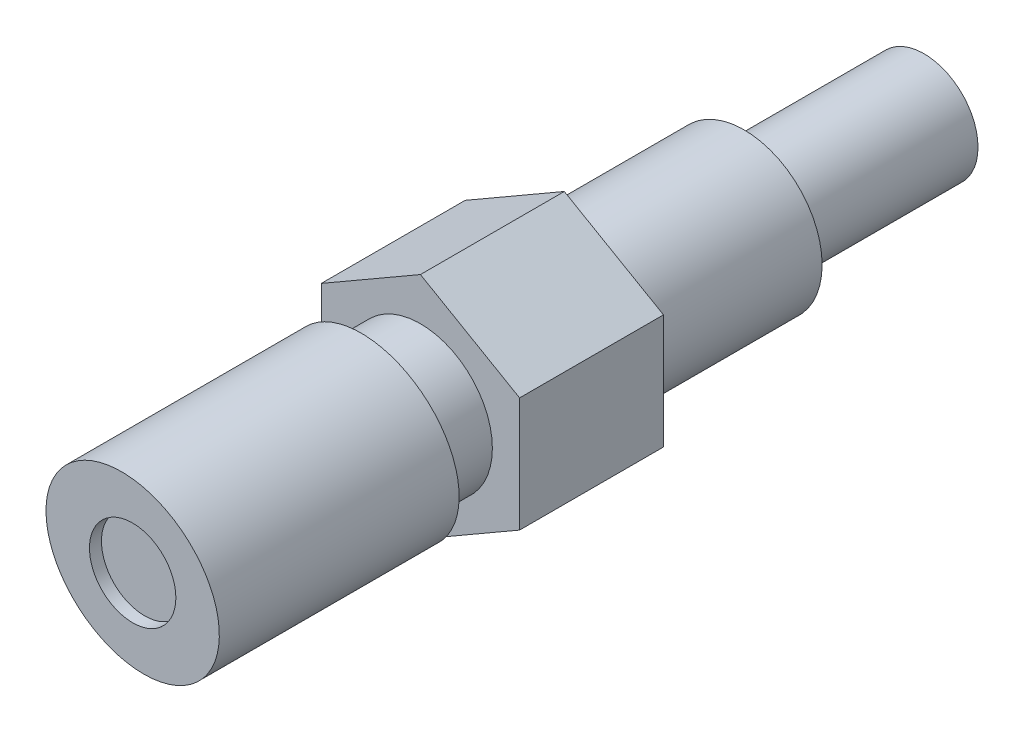
ISO-10303-21;
HEADER;
FILE_DESCRIPTION(('STEP AP214'),'2;1');
FILE_NAME('part.step','',(''),(''),'','','');
FILE_SCHEMA(('AUTOMOTIVE_DESIGN { 1 0 10303 214 1 1 1 1 }'));
ENDSEC;
DATA;
#1=APPLICATION_CONTEXT('core data for automotive mechanical design processes');
#2=APPLICATION_PROTOCOL_DEFINITION('international standard','automotive_design',2000,#1);
#3=PRODUCT_CONTEXT('',#1,'mechanical');
#4=PRODUCT('Part','Part','',(#3));
#5=PRODUCT_RELATED_PRODUCT_CATEGORY('part','',(#4));
#6=PRODUCT_DEFINITION_FORMATION('','',#4);
#7=PRODUCT_DEFINITION_CONTEXT('part definition',#1,'design');
#8=PRODUCT_DEFINITION('design','',#6,#7);
#9=PRODUCT_DEFINITION_SHAPE('','',#8);
#10=(LENGTH_UNIT() NAMED_UNIT(*) SI_UNIT(.MILLI.,.METRE.));
#11=(NAMED_UNIT(*) PLANE_ANGLE_UNIT() SI_UNIT($,.RADIAN.));
#12=(NAMED_UNIT(*) SI_UNIT($,.STERADIAN.) SOLID_ANGLE_UNIT());
#13=UNCERTAINTY_MEASURE_WITH_UNIT(LENGTH_MEASURE(1.E-05),#10,'distance_accuracy_value','');
#14=(GEOMETRIC_REPRESENTATION_CONTEXT(3) GLOBAL_UNCERTAINTY_ASSIGNED_CONTEXT((#13)) GLOBAL_UNIT_ASSIGNED_CONTEXT((#10,
#11,#12)) REPRESENTATION_CONTEXT('',''));
#15=CARTESIAN_POINT('',(0.,0.,0.));
#16=DIRECTION('',(0.,0.,1.));
#17=DIRECTION('',(1.,0.,0.));
#18=AXIS2_PLACEMENT_3D('',#15,#16,#17);
#19=CARTESIAN_POINT('',(0.,0.,15.));
#20=DIRECTION('',(0.,0.,-1.));
#21=DIRECTION('',(-1.,0.,0.));
#22=AXIS2_PLACEMENT_3D('',#19,#20,#21);
#23=CYLINDRICAL_SURFACE('',#22,4.5);
#24=CARTESIAN_POINT('',(0.,0.,15.));
#25=DIRECTION('',(0.,0.,1.));
#26=DIRECTION('',(1.,0.,0.));
#27=AXIS2_PLACEMENT_3D('',#24,#25,#26);
#28=CIRCLE('',#27,4.5);
#29=CARTESIAN_POINT('',(4.5,0.,15.));
#30=VERTEX_POINT('',#29);
#31=EDGE_CURVE('E11',#30,#30,#28,.T.);
#32=ORIENTED_EDGE('',*,*,#31,.F.);
#33=EDGE_LOOP('',(#32));
#34=FACE_BOUND('',#33,.T.);
#35=CARTESIAN_POINT('',(0.,0.,0.));
#36=DIRECTION('',(0.,0.,1.));
#37=DIRECTION('',(1.,0.,0.));
#38=AXIS2_PLACEMENT_3D('',#35,#36,#37);
#39=CIRCLE('',#38,4.5);
#40=CARTESIAN_POINT('',(4.5,0.,0.));
#41=VERTEX_POINT('',#40);
#42=EDGE_CURVE('E35',#41,#41,#39,.T.);
#43=ORIENTED_EDGE('',*,*,#42,.T.);
#44=EDGE_LOOP('',(#43));
#45=FACE_BOUND('',#44,.T.);
#46=ADVANCED_FACE('F32',(#34,#45),#23,.T.);
#47=CARTESIAN_POINT('',(0.,0.,0.));
#48=DIRECTION('',(0.,0.,1.));
#49=DIRECTION('',(1.,0.,0.));
#50=AXIS2_PLACEMENT_3D('',#47,#48,#49);
#51=PLANE('',#50);
#52=ORIENTED_EDGE('',*,*,#42,.F.);
#53=EDGE_LOOP('',(#52));
#54=FACE_BOUND('',#53,.T.);
#55=ADVANCED_FACE('F158',(#54),#51,.F.);
#56=CARTESIAN_POINT('',(0.,0.,30.));
#57=DIRECTION('',(0.,0.,-1.));
#58=DIRECTION('',(-1.,0.,0.));
#59=AXIS2_PLACEMENT_3D('',#56,#57,#58);
#60=CYLINDRICAL_SURFACE('',#59,6.5);
#61=CARTESIAN_POINT('',(0.,0.,30.));
#62=DIRECTION('',(0.,0.,1.));
#63=DIRECTION('',(1.,0.,0.));
#64=AXIS2_PLACEMENT_3D('',#61,#62,#63);
#65=CIRCLE('',#64,6.5);
#66=CARTESIAN_POINT('',(6.5,0.,30.));
#67=VERTEX_POINT('',#66);
#68=EDGE_CURVE('E138',#67,#67,#65,.T.);
#69=ORIENTED_EDGE('',*,*,#68,.F.);
#70=EDGE_LOOP('',(#69));
#71=FACE_BOUND('',#70,.T.);
#72=CARTESIAN_POINT('',(0.,0.,15.));
#73=DIRECTION('',(0.,0.,1.));
#74=DIRECTION('',(1.,0.,0.));
#75=AXIS2_PLACEMENT_3D('',#72,#73,#74);
#76=CIRCLE('',#75,6.5);
#77=CARTESIAN_POINT('',(6.5,0.,15.));
#78=VERTEX_POINT('',#77);
#79=EDGE_CURVE('E137',#78,#78,#76,.T.);
#80=ORIENTED_EDGE('',*,*,#79,.T.);
#81=EDGE_LOOP('',(#80));
#82=FACE_BOUND('',#81,.T.);
#83=ADVANCED_FACE('F144',(#71,#82),#60,.T.);
#84=CARTESIAN_POINT('',(0.,0.,15.));
#85=DIRECTION('',(0.,0.,1.));
#86=DIRECTION('',(1.,0.,0.));
#87=AXIS2_PLACEMENT_3D('',#84,#85,#86);
#88=PLANE('',#87);
#89=ORIENTED_EDGE('',*,*,#31,.T.);
#90=EDGE_LOOP('',(#89));
#91=FACE_BOUND('',#90,.T.);
#92=ORIENTED_EDGE('',*,*,#79,.F.);
#93=EDGE_LOOP('',(#92));
#94=FACE_BOUND('',#93,.T.);
#95=ADVANCED_FACE('F146',(#91,#94),#88,.F.);
#96=CARTESIAN_POINT('',(-8.26942769592284,-4.77435630628533,42.));
#97=DIRECTION('',(0.499999999999995,0.866025403784442,0.));
#98=DIRECTION('',(-0.866025403784442,0.499999999999995,0.));
#99=AXIS2_PLACEMENT_3D('',#96,#97,#98);
#100=PLANE('',#99);
#101=DIRECTION('',(0.866025403784441,-0.499999999999995,0.));
#102=VECTOR('',#101,1.);
#103=CARTESIAN_POINT('',(-8.26942769592284,-4.77435630628533,30.));
#104=LINE('',#103,#102);
#105=CARTESIAN_POINT('',(-8.26942769592284,-4.77435630628533,30.));
#106=VERTEX_POINT('',#105);
#107=CARTESIAN_POINT('',(0.,-9.54871261257047,30.));
#108=VERTEX_POINT('',#107);
#109=EDGE_CURVE('E117',#106,#108,#104,.T.);
#110=ORIENTED_EDGE('',*,*,#109,.T.);
#111=DIRECTION('',(0.,0.,-1.));
#112=VECTOR('',#111,1.);
#113=CARTESIAN_POINT('',(0.,-9.54871261257047,42.));
#114=LINE('',#113,#112);
#115=CARTESIAN_POINT('',(0.,-9.54871261257047,42.));
#116=VERTEX_POINT('',#115);
#117=EDGE_CURVE('E135',#116,#108,#114,.T.);
#118=ORIENTED_EDGE('',*,*,#117,.F.);
#119=DIRECTION('',(0.866025403784441,-0.499999999999995,0.));
#120=VECTOR('',#119,1.);
#121=CARTESIAN_POINT('',(-8.26942769592284,-4.77435630628533,42.));
#122=LINE('',#121,#120);
#123=CARTESIAN_POINT('',(-8.26942769592284,-4.77435630628533,42.));
#124=VERTEX_POINT('',#123);
#125=EDGE_CURVE('E128',#124,#116,#122,.T.);
#126=ORIENTED_EDGE('',*,*,#125,.F.);
#127=DIRECTION('',(0.,0.,-1.));
#128=VECTOR('',#127,1.);
#129=CARTESIAN_POINT('',(-8.26942769592284,-4.77435630628533,42.));
#130=LINE('',#129,#128);
#131=EDGE_CURVE('E113',#124,#106,#130,.T.);
#132=ORIENTED_EDGE('',*,*,#131,.T.);
#133=EDGE_LOOP('',(#110,#118,#126,#132));
#134=FACE_BOUND('',#133,.T.);
#135=ADVANCED_FACE('F148',(#134),#100,.F.);
#136=CARTESIAN_POINT('',(0.,-9.54871261257047,42.));
#137=DIRECTION('',(-0.500000000000001,0.866025403784438,0.));
#138=DIRECTION('',(-0.866025403784438,-0.500000000000001,0.));
#139=AXIS2_PLACEMENT_3D('',#136,#137,#138);
#140=PLANE('',#139);
#141=DIRECTION('',(0.866025403784438,0.500000000000001,0.));
#142=VECTOR('',#141,1.);
#143=CARTESIAN_POINT('',(0.,-9.54871261257047,30.));
#144=LINE('',#143,#142);
#145=CARTESIAN_POINT('',(8.26942769592291,-4.77435630628521,30.));
#146=VERTEX_POINT('',#145);
#147=EDGE_CURVE('E120',#108,#146,#144,.T.);
#148=ORIENTED_EDGE('',*,*,#147,.T.);
#149=DIRECTION('',(0.,0.,-1.));
#150=VECTOR('',#149,1.);
#151=CARTESIAN_POINT('',(8.26942769592291,-4.77435630628521,42.));
#152=LINE('',#151,#150);
#153=CARTESIAN_POINT('',(8.26942769592291,-4.77435630628521,42.));
#154=VERTEX_POINT('',#153);
#155=EDGE_CURVE('E132',#154,#146,#152,.T.);
#156=ORIENTED_EDGE('',*,*,#155,.F.);
#157=DIRECTION('',(0.866025403784438,0.500000000000001,0.));
#158=VECTOR('',#157,1.);
#159=CARTESIAN_POINT('',(0.,-9.54871261257047,42.));
#160=LINE('',#159,#158);
#161=EDGE_CURVE('E86',#116,#154,#160,.T.);
#162=ORIENTED_EDGE('',*,*,#161,.F.);
#163=ORIENTED_EDGE('',*,*,#117,.T.);
#164=EDGE_LOOP('',(#148,#156,#162,#163));
#165=FACE_BOUND('',#164,.T.);
#166=ADVANCED_FACE('F155',(#165),#140,.F.);
#167=CARTESIAN_POINT('',(8.26942769592291,-4.77435630628521,42.));
#168=DIRECTION('',(-1.,0.,0.));
#169=DIRECTION('',(0.,-1.,0.));
#170=AXIS2_PLACEMENT_3D('',#167,#168,#169);
#171=PLANE('',#170);
#172=DIRECTION('',(0.,1.,0.));
#173=VECTOR('',#172,1.);
#174=CARTESIAN_POINT('',(8.26942769592291,-4.77435630628521,30.));
#175=LINE('',#174,#173);
#176=CARTESIAN_POINT('',(8.26942769592288,4.77435630628527,30.));
#177=VERTEX_POINT('',#176);
#178=EDGE_CURVE('E123',#146,#177,#175,.T.);
#179=ORIENTED_EDGE('',*,*,#178,.T.);
#180=DIRECTION('',(0.,0.,-1.));
#181=VECTOR('',#180,1.);
#182=CARTESIAN_POINT('',(8.26942769592288,4.77435630628527,42.));
#183=LINE('',#182,#181);
#184=CARTESIAN_POINT('',(8.26942769592288,4.77435630628527,42.));
#185=VERTEX_POINT('',#184);
#186=EDGE_CURVE('E108',#185,#177,#183,.T.);
#187=ORIENTED_EDGE('',*,*,#186,.F.);
#188=DIRECTION('',(0.,1.,0.));
#189=VECTOR('',#188,1.);
#190=CARTESIAN_POINT('',(8.26942769592291,-4.77435630628521,42.));
#191=LINE('',#190,#189);
#192=EDGE_CURVE('E99',#154,#185,#191,.T.);
#193=ORIENTED_EDGE('',*,*,#192,.F.);
#194=ORIENTED_EDGE('',*,*,#155,.T.);
#195=EDGE_LOOP('',(#179,#187,#193,#194));
#196=FACE_BOUND('',#195,.T.);
#197=ADVANCED_FACE('F196',(#196),#171,.F.);
#198=CARTESIAN_POINT('',(8.26942769592288,4.77435630628527,42.));
#199=DIRECTION('',(-0.499999999999995,-0.866025403784441,0.));
#200=DIRECTION('',(0.866025403784442,-0.499999999999995,0.));
#201=AXIS2_PLACEMENT_3D('',#198,#199,#200);
#202=PLANE('',#201);
#203=DIRECTION('',(-0.866025403784442,0.499999999999995,0.));
#204=VECTOR('',#203,1.);
#205=CARTESIAN_POINT('',(8.26942769592288,4.77435630628527,30.));
#206=LINE('',#205,#204);
#207=CARTESIAN_POINT('',(0.,9.54871261257047,30.));
#208=VERTEX_POINT('',#207);
#209=EDGE_CURVE('E107',#177,#208,#206,.T.);
#210=ORIENTED_EDGE('',*,*,#209,.T.);
#211=DIRECTION('',(0.,0.,-1.));
#212=VECTOR('',#211,1.);
#213=CARTESIAN_POINT('',(0.,9.54871261257047,42.));
#214=LINE('',#213,#212);
#215=CARTESIAN_POINT('',(0.,9.54871261257047,42.));
#216=VERTEX_POINT('',#215);
#217=EDGE_CURVE('E104',#216,#208,#214,.T.);
#218=ORIENTED_EDGE('',*,*,#217,.F.);
#219=DIRECTION('',(-0.866025403784442,0.499999999999995,0.));
#220=VECTOR('',#219,1.);
#221=CARTESIAN_POINT('',(8.26942769592288,4.77435630628527,42.));
#222=LINE('',#221,#220);
#223=EDGE_CURVE('E93',#185,#216,#222,.T.);
#224=ORIENTED_EDGE('',*,*,#223,.F.);
#225=ORIENTED_EDGE('',*,*,#186,.T.);
#226=EDGE_LOOP('',(#210,#218,#224,#225));
#227=FACE_BOUND('',#226,.T.);
#228=ADVANCED_FACE('F105',(#227),#202,.F.);
#229=CARTESIAN_POINT('',(0.,9.54871261257047,42.));
#230=DIRECTION('',(0.500000000000007,-0.866025403784434,0.));
#231=DIRECTION('',(0.866025403784435,0.500000000000007,0.));
#232=AXIS2_PLACEMENT_3D('',#229,#230,#231);
#233=PLANE('',#232);
#234=DIRECTION('',(-0.866025403784435,-0.500000000000007,0.));
#235=VECTOR('',#234,1.);
#236=CARTESIAN_POINT('',(0.,9.54871261257047,30.));
#237=LINE('',#236,#235);
#238=CARTESIAN_POINT('',(-8.26942769592294,4.77435630628516,30.));
#239=VERTEX_POINT('',#238);
#240=EDGE_CURVE('E71',#208,#239,#237,.T.);
#241=ORIENTED_EDGE('',*,*,#240,.T.);
#242=DIRECTION('',(0.,0.,-1.));
#243=VECTOR('',#242,1.);
#244=CARTESIAN_POINT('',(-8.26942769592294,4.77435630628516,42.));
#245=LINE('',#244,#243);
#246=CARTESIAN_POINT('',(-8.26942769592294,4.77435630628516,42.));
#247=VERTEX_POINT('',#246);
#248=EDGE_CURVE('E109',#247,#239,#245,.T.);
#249=ORIENTED_EDGE('',*,*,#248,.F.);
#250=DIRECTION('',(-0.866025403784435,-0.500000000000007,0.));
#251=VECTOR('',#250,1.);
#252=CARTESIAN_POINT('',(0.,9.54871261257047,42.));
#253=LINE('',#252,#251);
#254=EDGE_CURVE('E97',#216,#247,#253,.T.);
#255=ORIENTED_EDGE('',*,*,#254,.F.);
#256=ORIENTED_EDGE('',*,*,#217,.T.);
#257=EDGE_LOOP('',(#241,#249,#255,#256));
#258=FACE_BOUND('',#257,.T.);
#259=ADVANCED_FACE('F111',(#258),#233,.F.);
#260=CARTESIAN_POINT('',(-8.26942769592294,4.77435630628516,42.));
#261=DIRECTION('',(1.,0.,0.));
#262=DIRECTION('',(0.,1.,0.));
#263=AXIS2_PLACEMENT_3D('',#260,#261,#262);
#264=PLANE('',#263);
#265=DIRECTION('',(0.,-1.,0.));
#266=VECTOR('',#265,1.);
#267=CARTESIAN_POINT('',(-8.26942769592294,4.77435630628516,30.));
#268=LINE('',#267,#266);
#269=EDGE_CURVE('E77',#239,#106,#268,.T.);
#270=ORIENTED_EDGE('',*,*,#269,.T.);
#271=ORIENTED_EDGE('',*,*,#131,.F.);
#272=DIRECTION('',(0.,-1.,0.));
#273=VECTOR('',#272,1.);
#274=CARTESIAN_POINT('',(-8.26942769592294,4.77435630628516,42.));
#275=LINE('',#274,#273);
#276=EDGE_CURVE('E48',#247,#124,#275,.T.);
#277=ORIENTED_EDGE('',*,*,#276,.F.);
#278=ORIENTED_EDGE('',*,*,#248,.T.);
#279=EDGE_LOOP('',(#270,#271,#277,#278));
#280=FACE_BOUND('',#279,.T.);
#281=ADVANCED_FACE('F222',(#280),#264,.F.);
#282=CARTESIAN_POINT('',(0.,0.,42.));
#283=DIRECTION('',(0.,0.,1.));
#284=DIRECTION('',(1.,0.,0.));
#285=AXIS2_PLACEMENT_3D('',#282,#283,#284);
#286=PLANE('',#285);
#287=CARTESIAN_POINT('',(0.,0.,42.));
#288=DIRECTION('',(0.,0.,1.));
#289=DIRECTION('',(1.,0.,0.));
#290=AXIS2_PLACEMENT_3D('',#287,#288,#289);
#291=CIRCLE('',#290,6.);
#292=CARTESIAN_POINT('',(6.,0.,42.));
#293=VERTEX_POINT('',#292);
#294=EDGE_CURVE('E320',#293,#293,#291,.T.);
#295=ORIENTED_EDGE('',*,*,#294,.F.);
#296=EDGE_LOOP('',(#295));
#297=FACE_BOUND('',#296,.T.);
#298=ORIENTED_EDGE('',*,*,#125,.T.);
#299=ORIENTED_EDGE('',*,*,#161,.T.);
#300=ORIENTED_EDGE('',*,*,#192,.T.);
#301=ORIENTED_EDGE('',*,*,#223,.T.);
#302=ORIENTED_EDGE('',*,*,#254,.T.);
#303=ORIENTED_EDGE('',*,*,#276,.T.);
#304=EDGE_LOOP('',(#298,#299,#300,#301,#302,#303));
#305=FACE_BOUND('',#304,.T.);
#306=ADVANCED_FACE('F95',(#297,#305),#286,.T.);
#307=CARTESIAN_POINT('',(0.,0.,30.));
#308=DIRECTION('',(0.,0.,1.));
#309=DIRECTION('',(1.,0.,0.));
#310=AXIS2_PLACEMENT_3D('',#307,#308,#309);
#311=PLANE('',#310);
#312=ORIENTED_EDGE('',*,*,#68,.T.);
#313=EDGE_LOOP('',(#312));
#314=FACE_BOUND('',#313,.T.);
#315=ORIENTED_EDGE('',*,*,#109,.F.);
#316=ORIENTED_EDGE('',*,*,#269,.F.);
#317=ORIENTED_EDGE('',*,*,#240,.F.);
#318=ORIENTED_EDGE('',*,*,#209,.F.);
#319=ORIENTED_EDGE('',*,*,#178,.F.);
#320=ORIENTED_EDGE('',*,*,#147,.F.);
#321=EDGE_LOOP('',(#315,#316,#317,#318,#319,#320));
#322=FACE_BOUND('',#321,.T.);
#323=ADVANCED_FACE('F237',(#314,#322),#311,.F.);
#324=CARTESIAN_POINT('',(0.,0.,46.));
#325=DIRECTION('',(0.,0.,-1.));
#326=DIRECTION('',(-1.,0.,0.));
#327=AXIS2_PLACEMENT_3D('',#324,#325,#326);
#328=CYLINDRICAL_SURFACE('',#327,6.);
#329=CARTESIAN_POINT('',(0.,0.,46.));
#330=DIRECTION('',(0.,0.,1.));
#331=DIRECTION('',(1.,0.,0.));
#332=AXIS2_PLACEMENT_3D('',#329,#330,#331);
#333=CIRCLE('',#332,6.);
#334=CARTESIAN_POINT('',(6.,0.,46.));
#335=VERTEX_POINT('',#334);
#336=EDGE_CURVE('E121',#335,#335,#333,.T.);
#337=ORIENTED_EDGE('',*,*,#336,.F.);
#338=EDGE_LOOP('',(#337));
#339=FACE_BOUND('',#338,.T.);
#340=ORIENTED_EDGE('',*,*,#294,.T.);
#341=EDGE_LOOP('',(#340));
#342=FACE_BOUND('',#341,.T.);
#343=ADVANCED_FACE('F242',(#339,#342),#328,.T.);
#344=CARTESIAN_POINT('',(0.,0.,66.));
#345=DIRECTION('',(0.,0.,1.));
#346=DIRECTION('',(0.833044377310739,-0.553206169010218,0.));
#347=AXIS2_PLACEMENT_3D('',#344,#345,#346);
#348=ELLIPSE('',#347,7.51268499768407,6.5350839600044);
#349=DIRECTION('',(0.,0.,-1.));
#350=VECTOR('',#349,1.);
#351=SURFACE_OF_LINEAR_EXTRUSION('',#348,#350);
#352=CARTESIAN_POINT('',(6.25839999582746,-4.15606368654934,66.));
#353=VERTEX_POINT('',#352);
#354=EDGE_CURVE('E315',#353,#353,#348,.T.);
#355=ORIENTED_EDGE('',*,*,#354,.F.);
#356=EDGE_LOOP('',(#355));
#357=FACE_BOUND('',#356,.T.);
#358=CARTESIAN_POINT('',(0.,0.,46.));
#359=DIRECTION('',(0.,0.,1.));
#360=DIRECTION('',(0.833044377310739,-0.553206169010218,0.));
#361=AXIS2_PLACEMENT_3D('',#358,#359,#360);
#362=ELLIPSE('',#361,7.51268499768407,6.5350839600044);
#363=CARTESIAN_POINT('',(6.25839999582746,-4.15606368654934,46.));
#364=VERTEX_POINT('',#363);
#365=EDGE_CURVE('E321',#364,#364,#362,.T.);
#366=ORIENTED_EDGE('',*,*,#365,.T.);
#367=EDGE_LOOP('',(#366));
#368=FACE_BOUND('',#367,.T.);
#369=ADVANCED_FACE('F259',(#357,#368),#351,.F.);
#370=CARTESIAN_POINT('',(0.,0.,66.));
#371=DIRECTION('',(0.,0.,1.));
#372=DIRECTION('',(1.,0.,0.));
#373=AXIS2_PLACEMENT_3D('',#370,#371,#372);
#374=PLANE('',#373);
#375=CARTESIAN_POINT('',(0.,0.,66.));
#376=DIRECTION('',(0.,0.,1.));
#377=DIRECTION('',(1.,0.,0.));
#378=AXIS2_PLACEMENT_3D('',#375,#376,#377);
#379=CIRCLE('',#378,3.6032344244822);
#380=CARTESIAN_POINT('',(3.6032344244822,0.,66.));
#381=VERTEX_POINT('',#380);
#382=EDGE_CURVE('E322',#381,#381,#379,.T.);
#383=ORIENTED_EDGE('',*,*,#382,.F.);
#384=EDGE_LOOP('',(#383));
#385=FACE_BOUND('',#384,.T.);
#386=ORIENTED_EDGE('',*,*,#354,.T.);
#387=EDGE_LOOP('',(#386));
#388=FACE_BOUND('',#387,.T.);
#389=ADVANCED_FACE('F269',(#385,#388),#374,.T.);
#390=CARTESIAN_POINT('',(0.,0.,46.));
#391=DIRECTION('',(0.,0.,1.));
#392=DIRECTION('',(1.,0.,0.));
#393=AXIS2_PLACEMENT_3D('',#390,#391,#392);
#394=PLANE('',#393);
#395=ORIENTED_EDGE('',*,*,#336,.T.);
#396=EDGE_LOOP('',(#395));
#397=FACE_BOUND('',#396,.T.);
#398=ORIENTED_EDGE('',*,*,#365,.F.);
#399=EDGE_LOOP('',(#398));
#400=FACE_BOUND('',#399,.T.);
#401=ADVANCED_FACE('F277',(#397,#400),#394,.F.);
#402=CARTESIAN_POINT('',(0.,0.,65.));
#403=DIRECTION('',(0.,0.,1.));
#404=DIRECTION('',(1.,0.,0.));
#405=AXIS2_PLACEMENT_3D('',#402,#403,#404);
#406=CYLINDRICAL_SURFACE('',#405,3.6032344244822);
#407=CARTESIAN_POINT('',(0.,0.,65.));
#408=DIRECTION('',(0.,0.,1.));
#409=DIRECTION('',(1.,0.,0.));
#410=AXIS2_PLACEMENT_3D('',#407,#408,#409);
#411=CIRCLE('',#410,3.6032344244822);
#412=CARTESIAN_POINT('',(3.6032344244822,0.,65.));
#413=VERTEX_POINT('',#412);
#414=EDGE_CURVE('E326',#413,#413,#411,.T.);
#415=ORIENTED_EDGE('',*,*,#414,.F.);
#416=EDGE_LOOP('',(#415));
#417=FACE_BOUND('',#416,.T.);
#418=ORIENTED_EDGE('',*,*,#382,.T.);
#419=EDGE_LOOP('',(#418));
#420=FACE_BOUND('',#419,.T.);
#421=ADVANCED_FACE('F282',(#417,#420),#406,.F.);
#422=CARTESIAN_POINT('',(0.,0.,65.));
#423=DIRECTION('',(0.,0.,1.));
#424=DIRECTION('',(1.,0.,0.));
#425=AXIS2_PLACEMENT_3D('',#422,#423,#424);
#426=PLANE('',#425);
#427=ORIENTED_EDGE('',*,*,#414,.T.);
#428=EDGE_LOOP('',(#427));
#429=FACE_BOUND('',#428,.T.);
#430=ADVANCED_FACE('F299',(#429),#426,.T.);
#431=CLOSED_SHELL('',(#46,#55,#83,#95,#135,#166,#197,#228,#259,#281,#306,#323,#343,#369,#389,
#401,#421,#430));
#432=MANIFOLD_SOLID_BREP('B2',#431);
#433=ADVANCED_BREP_SHAPE_REPRESENTATION('',(#18,#432),#14);
#434=SHAPE_DEFINITION_REPRESENTATION(#9,#433);
ENDSEC;
END-ISO-10303-21;
